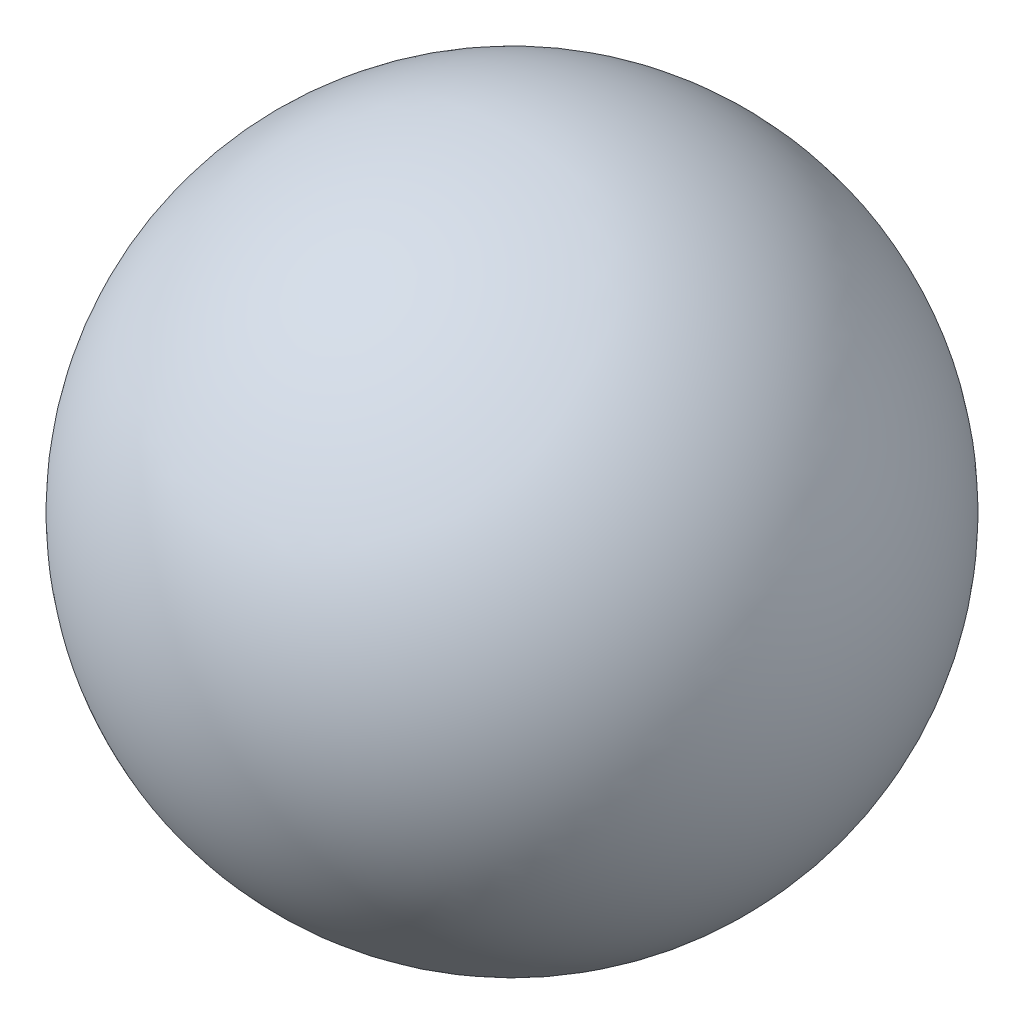
ISO-10303-21;
HEADER;
FILE_DESCRIPTION(('STEP AP214'),'2;1');
FILE_NAME('part.step','',(''),(''),'','','');
FILE_SCHEMA(('AUTOMOTIVE_DESIGN { 1 0 10303 214 1 1 1 1 }'));
ENDSEC;
DATA;
#1=APPLICATION_CONTEXT('core data for automotive mechanical design processes');
#2=APPLICATION_PROTOCOL_DEFINITION('international standard','automotive_design',2000,#1);
#3=PRODUCT_CONTEXT('',#1,'mechanical');
#4=PRODUCT('Part','Part','',(#3));
#5=PRODUCT_RELATED_PRODUCT_CATEGORY('part','',(#4));
#6=PRODUCT_DEFINITION_FORMATION('','',#4);
#7=PRODUCT_DEFINITION_CONTEXT('part definition',#1,'design');
#8=PRODUCT_DEFINITION('design','',#6,#7);
#9=PRODUCT_DEFINITION_SHAPE('','',#8);
#10=(LENGTH_UNIT() NAMED_UNIT(*) SI_UNIT(.MILLI.,.METRE.));
#11=(NAMED_UNIT(*) PLANE_ANGLE_UNIT() SI_UNIT($,.RADIAN.));
#12=(NAMED_UNIT(*) SI_UNIT($,.STERADIAN.) SOLID_ANGLE_UNIT());
#13=UNCERTAINTY_MEASURE_WITH_UNIT(LENGTH_MEASURE(1.E-05),#10,'distance_accuracy_value','');
#14=(GEOMETRIC_REPRESENTATION_CONTEXT(3) GLOBAL_UNCERTAINTY_ASSIGNED_CONTEXT((#13)) GLOBAL_UNIT_ASSIGNED_CONTEXT((#10,
#11,#12)) REPRESENTATION_CONTEXT('',''));
#15=CARTESIAN_POINT('',(0.,0.,0.));
#16=DIRECTION('',(0.,0.,1.));
#17=DIRECTION('',(1.,0.,0.));
#18=AXIS2_PLACEMENT_3D('',#15,#16,#17);
#19=CARTESIAN_POINT('',(-1.130687400779,-23.36010851165,127.6972796461));
#20=DIRECTION('',(0.,0.,-1.));
#21=DIRECTION('',(-1.,0.,0.));
#22=AXIS2_PLACEMENT_3D('',#19,#20,#21);
#23=PLANE('',#22);
#24=CARTESIAN_POINT('',(3.100488266681,-27.59128417911,127.6972796461));
#25=DIRECTION('',(0.,0.,-1.));
#26=DIRECTION('',(-1.,0.,0.));
#27=AXIS2_PLACEMENT_3D('',#24,#25,#26);
#28=CIRCLE('',#27,3.5);
#29=CARTESIAN_POINT('',(-0.399511733319,-27.59128417911,127.6972796461));
#30=VERTEX_POINT('',#29);
#31=EDGE_CURVE('E18',#30,#30,#28,.T.);
#32=ORIENTED_EDGE('',*,*,#31,.T.);
#33=EDGE_LOOP('',(#32));
#34=FACE_BOUND('',#33,.T.);
#35=ADVANCED_FACE('F14',(#34),#23,.T.);
#36=CARTESIAN_POINT('',(3.100488266681,-27.59128417911,125.6972796461));
#37=DIRECTION('',(0.,0.,-1.));
#38=DIRECTION('',(-1.,0.,0.));
#39=AXIS2_PLACEMENT_3D('',#36,#37,#38);
#40=CYLINDRICAL_SURFACE('',#39,3.5);
#41=ORIENTED_EDGE('',*,*,#31,.F.);
#42=EDGE_LOOP('',(#41));
#43=FACE_BOUND('',#42,.T.);
#44=CARTESIAN_POINT('',(3.100488266681,-27.59128417911,123.697279646194));
#45=DIRECTION('',(0.,0.,-1.));
#46=DIRECTION('',(-1.,0.,0.));
#47=AXIS2_PLACEMENT_3D('',#44,#45,#46);
#48=CIRCLE('',#47,3.50000000002985);
#49=CARTESIAN_POINT('',(-0.399511733348845,-27.59128417911,123.697279646194));
#50=VERTEX_POINT('',#49);
#51=EDGE_CURVE('E22',#50,#50,#48,.T.);
#52=ORIENTED_EDGE('',*,*,#51,.T.);
#53=EDGE_LOOP('',(#52));
#54=FACE_BOUND('',#53,.T.);
#55=ADVANCED_FACE('F35',(#43,#54),#40,.F.);
#56=CARTESIAN_POINT('',(3.100488266681,-27.59128417911,122.697277811881));
#57=DIRECTION('',(0.,0.,-1.));
#58=DIRECTION('',(-1.,0.,0.));
#59=AXIS2_PLACEMENT_3D('',#56,#57,#58);
#60=CONICAL_SURFACE('',#59,4.50000183434333,0.78539816342587);
#61=ORIENTED_EDGE('',*,*,#51,.F.);
#62=EDGE_LOOP('',(#61));
#63=FACE_BOUND('',#62,.T.);
#64=CARTESIAN_POINT('',(3.100488266681,-27.59128417911,122.697279646129));
#65=DIRECTION('',(0.,0.,1.));
#66=DIRECTION('',(1.,0.,0.));
#67=AXIS2_PLACEMENT_3D('',#64,#65,#66);
#68=CIRCLE('',#67,4.50000000003839);
#69=CARTESIAN_POINT('',(7.60048826671939,-27.59128417911,122.697279646129));
#70=VERTEX_POINT('',#69);
#71=EDGE_CURVE('E10',#70,#70,#68,.T.);
#72=ORIENTED_EDGE('',*,*,#71,.F.);
#73=EDGE_LOOP('',(#72));
#74=FACE_BOUND('',#73,.T.);
#75=ADVANCED_FACE('F37',(#63,#74),#60,.F.);
#76=CARTESIAN_POINT('',(3.100488266681,-27.59128417911,128.6972796461));
#77=DIRECTION('',(0.,0.,1.));
#78=DIRECTION('',(0.,-1.,0.));
#79=AXIS2_PLACEMENT_3D('',#76,#77,#78);
#80=SPHERICAL_SURFACE('',#79,7.5);
#81=ORIENTED_EDGE('',*,*,#71,.T.);
#82=EDGE_LOOP('',(#81));
#83=FACE_BOUND('',#82,.T.);
#84=ADVANCED_FACE('F16',(#83),#80,.T.);
#85=CLOSED_SHELL('',(#35,#55,#75,#84));
#86=MANIFOLD_SOLID_BREP('B1',#85);
#87=ADVANCED_BREP_SHAPE_REPRESENTATION('',(#18,#86),#14);
#88=SHAPE_DEFINITION_REPRESENTATION(#9,#87);
ENDSEC;
END-ISO-10303-21;
